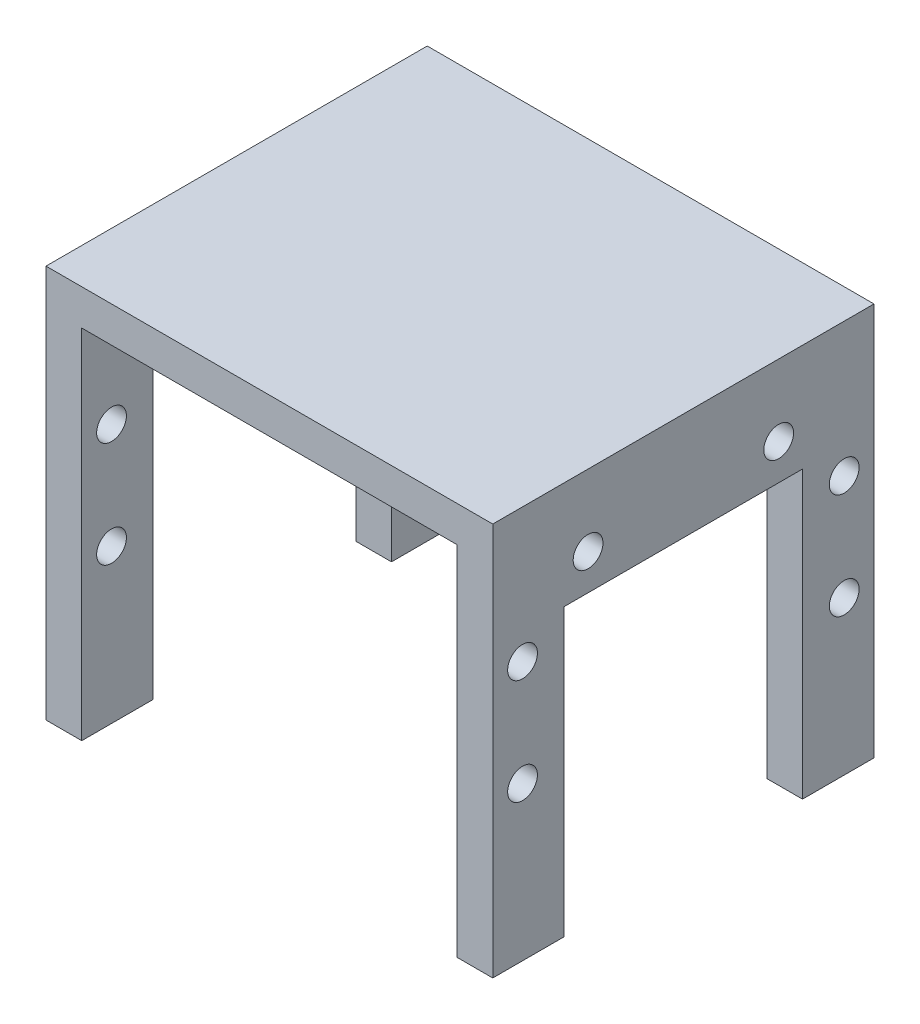
ISO-10303-21;
HEADER;
FILE_DESCRIPTION(('STEP AP214'),'2;1');
FILE_NAME('part.step','',(''),(''),'','','');
FILE_SCHEMA(('AUTOMOTIVE_DESIGN { 1 0 10303 214 1 1 1 1 }'));
ENDSEC;
DATA;
#1=APPLICATION_CONTEXT('core data for automotive mechanical design processes');
#2=APPLICATION_PROTOCOL_DEFINITION('international standard','automotive_design',2000,#1);
#3=PRODUCT_CONTEXT('',#1,'mechanical');
#4=PRODUCT('Part','Part','',(#3));
#5=PRODUCT_RELATED_PRODUCT_CATEGORY('part','',(#4));
#6=PRODUCT_DEFINITION_FORMATION('','',#4);
#7=PRODUCT_DEFINITION_CONTEXT('part definition',#1,'design');
#8=PRODUCT_DEFINITION('design','',#6,#7);
#9=PRODUCT_DEFINITION_SHAPE('','',#8);
#10=(LENGTH_UNIT() NAMED_UNIT(*) SI_UNIT(.MILLI.,.METRE.));
#11=(NAMED_UNIT(*) PLANE_ANGLE_UNIT() SI_UNIT($,.RADIAN.));
#12=(NAMED_UNIT(*) SI_UNIT($,.STERADIAN.) SOLID_ANGLE_UNIT());
#13=UNCERTAINTY_MEASURE_WITH_UNIT(LENGTH_MEASURE(1.E-05),#10,'distance_accuracy_value','');
#14=(GEOMETRIC_REPRESENTATION_CONTEXT(3) GLOBAL_UNCERTAINTY_ASSIGNED_CONTEXT((#13)) GLOBAL_UNIT_ASSIGNED_CONTEXT((#10,
#11,#12)) REPRESENTATION_CONTEXT('',''));
#15=CARTESIAN_POINT('',(0.,0.,0.));
#16=DIRECTION('',(0.,0.,1.));
#17=DIRECTION('',(1.,0.,0.));
#18=AXIS2_PLACEMENT_3D('',#15,#16,#17);
#19=CARTESIAN_POINT('',(-3.,0.,-32.));
#20=DIRECTION('',(0.,1.,0.));
#21=DIRECTION('',(0.,0.,-1.));
#22=AXIS2_PLACEMENT_3D('',#19,#20,#21);
#23=PLANE('',#22);
#24=DIRECTION('',(0.,0.,1.));
#25=VECTOR('',#24,1.);
#26=CARTESIAN_POINT('',(-3.,0.,-32.));
#27=LINE('',#26,#25);
#28=CARTESIAN_POINT('',(-3.,0.,-32.));
#29=VERTEX_POINT('',#28);
#30=CARTESIAN_POINT('',(-3.,0.,-26.));
#31=VERTEX_POINT('',#30);
#32=EDGE_CURVE('E240',#29,#31,#27,.T.);
#33=ORIENTED_EDGE('',*,*,#32,.F.);
#34=DIRECTION('',(1.,0.,0.));
#35=VECTOR('',#34,1.);
#36=CARTESIAN_POINT('',(-3.,0.,-32.));
#37=LINE('',#36,#35);
#38=CARTESIAN_POINT('',(0.,0.,-32.));
#39=VERTEX_POINT('',#38);
#40=EDGE_CURVE('E239',#29,#39,#37,.T.);
#41=ORIENTED_EDGE('',*,*,#40,.T.);
#42=DIRECTION('',(0.,0.,1.));
#43=VECTOR('',#42,1.);
#44=CARTESIAN_POINT('',(0.,0.,-32.));
#45=LINE('',#44,#43);
#46=CARTESIAN_POINT('',(0.,0.,-26.));
#47=VERTEX_POINT('',#46);
#48=EDGE_CURVE('E11',#39,#47,#45,.T.);
#49=ORIENTED_EDGE('',*,*,#48,.T.);
#50=DIRECTION('',(1.,0.,0.));
#51=VECTOR('',#50,1.);
#52=CARTESIAN_POINT('',(-34.2409987036266,0.,-26.));
#53=LINE('',#52,#51);
#54=EDGE_CURVE('E170',#31,#47,#53,.T.);
#55=ORIENTED_EDGE('',*,*,#54,.F.);
#56=EDGE_LOOP('',(#33,#41,#49,#55));
#57=FACE_BOUND('',#56,.T.);
#58=ADVANCED_FACE('F35',(#57),#23,.F.);
#59=CARTESIAN_POINT('',(31.5,0.,-32.));
#60=DIRECTION('',(0.,1.,0.));
#61=DIRECTION('',(-1.,0.,0.));
#62=AXIS2_PLACEMENT_3D('',#59,#60,#61);
#63=PLANE('',#62);
#64=DIRECTION('',(0.,0.,1.));
#65=VECTOR('',#64,1.);
#66=CARTESIAN_POINT('',(31.5,0.,-32.));
#67=LINE('',#66,#65);
#68=CARTESIAN_POINT('',(31.5,0.,-32.));
#69=VERTEX_POINT('',#68);
#70=CARTESIAN_POINT('',(31.5,0.,-26.));
#71=VERTEX_POINT('',#70);
#72=EDGE_CURVE('E179',#69,#71,#67,.T.);
#73=ORIENTED_EDGE('',*,*,#72,.F.);
#74=DIRECTION('',(1.,0.,0.));
#75=VECTOR('',#74,1.);
#76=CARTESIAN_POINT('',(31.5,0.,-32.));
#77=LINE('',#76,#75);
#78=CARTESIAN_POINT('',(34.5,0.,-32.));
#79=VERTEX_POINT('',#78);
#80=EDGE_CURVE('E174',#69,#79,#77,.T.);
#81=ORIENTED_EDGE('',*,*,#80,.T.);
#82=DIRECTION('',(0.,0.,1.));
#83=VECTOR('',#82,1.);
#84=CARTESIAN_POINT('',(34.5,0.,-32.));
#85=LINE('',#84,#83);
#86=CARTESIAN_POINT('',(34.5,0.,-26.));
#87=VERTEX_POINT('',#86);
#88=EDGE_CURVE('E155',#79,#87,#85,.T.);
#89=ORIENTED_EDGE('',*,*,#88,.T.);
#90=EDGE_CURVE('E163',#71,#87,#53,.T.);
#91=ORIENTED_EDGE('',*,*,#90,.F.);
#92=EDGE_LOOP('',(#73,#81,#89,#91));
#93=FACE_BOUND('',#92,.T.);
#94=ADVANCED_FACE('F172',(#93),#63,.F.);
#95=CARTESIAN_POINT('',(0.,0.,-6.));
#96=VERTEX_POINT('',#95);
#97=CARTESIAN_POINT('',(0.,0.,0.));
#98=VERTEX_POINT('',#97);
#99=EDGE_CURVE('E43',#96,#98,#45,.T.);
#100=ORIENTED_EDGE('',*,*,#99,.T.);
#101=DIRECTION('',(1.,0.,0.));
#102=VECTOR('',#101,1.);
#103=CARTESIAN_POINT('',(-3.,0.,0.));
#104=LINE('',#103,#102);
#105=CARTESIAN_POINT('',(-3.,0.,0.));
#106=VERTEX_POINT('',#105);
#107=EDGE_CURVE('E200',#106,#98,#104,.T.);
#108=ORIENTED_EDGE('',*,*,#107,.F.);
#109=CARTESIAN_POINT('',(-3.,0.,-6.));
#110=VERTEX_POINT('',#109);
#111=EDGE_CURVE('E243',#110,#106,#27,.T.);
#112=ORIENTED_EDGE('',*,*,#111,.F.);
#113=DIRECTION('',(1.,0.,0.));
#114=VECTOR('',#113,1.);
#115=CARTESIAN_POINT('',(-34.2409987036266,0.,-6.));
#116=LINE('',#115,#114);
#117=EDGE_CURVE('E202',#110,#96,#116,.T.);
#118=ORIENTED_EDGE('',*,*,#117,.T.);
#119=EDGE_LOOP('',(#100,#108,#112,#118));
#120=FACE_BOUND('',#119,.T.);
#121=ADVANCED_FACE('F37',(#120),#23,.F.);
#122=CARTESIAN_POINT('',(0.,0.,-32.));
#123=DIRECTION('',(-1.,0.,0.));
#124=DIRECTION('',(0.,0.,-1.));
#125=AXIS2_PLACEMENT_3D('',#122,#123,#124);
#126=PLANE('',#125);
#127=CARTESIAN_POINT('',(0.,12.89624,-29.5));
#128=DIRECTION('',(1.,0.,0.));
#129=DIRECTION('',(0.,0.,-1.));
#130=AXIS2_PLACEMENT_3D('',#127,#128,#129);
#131=CIRCLE('',#130,1.25);
#132=CARTESIAN_POINT('',(0.,12.89624,-30.75));
#133=VERTEX_POINT('',#132);
#134=EDGE_CURVE('E512',#133,#133,#131,.T.);
#135=ORIENTED_EDGE('',*,*,#134,.F.);
#136=EDGE_LOOP('',(#135));
#137=FACE_BOUND('',#136,.T.);
#138=CARTESIAN_POINT('',(0.,21.75,-29.5));
#139=DIRECTION('',(1.,0.,0.));
#140=DIRECTION('',(0.,0.,-1.));
#141=AXIS2_PLACEMENT_3D('',#138,#139,#140);
#142=CIRCLE('',#141,1.25);
#143=CARTESIAN_POINT('',(0.,21.75,-30.75));
#144=VERTEX_POINT('',#143);
#145=EDGE_CURVE('E530',#144,#144,#142,.T.);
#146=ORIENTED_EDGE('',*,*,#145,.F.);
#147=EDGE_LOOP('',(#146));
#148=FACE_BOUND('',#147,.T.);
#149=CARTESIAN_POINT('',(0.,12.89624,-2.5));
#150=DIRECTION('',(1.,0.,0.));
#151=DIRECTION('',(0.,0.,-1.));
#152=AXIS2_PLACEMENT_3D('',#149,#150,#151);
#153=CIRCLE('',#152,1.25);
#154=CARTESIAN_POINT('',(0.,12.89624,-3.75));
#155=VERTEX_POINT('',#154);
#156=EDGE_CURVE('E542',#155,#155,#153,.T.);
#157=ORIENTED_EDGE('',*,*,#156,.F.);
#158=EDGE_LOOP('',(#157));
#159=FACE_BOUND('',#158,.T.);
#160=CARTESIAN_POINT('',(0.,21.75,-2.5));
#161=DIRECTION('',(1.,0.,0.));
#162=DIRECTION('',(0.,0.,-1.));
#163=AXIS2_PLACEMENT_3D('',#160,#161,#162);
#164=CIRCLE('',#163,1.25);
#165=CARTESIAN_POINT('',(0.,21.75,-3.75));
#166=VERTEX_POINT('',#165);
#167=EDGE_CURVE('E554',#166,#166,#164,.T.);
#168=ORIENTED_EDGE('',*,*,#167,.F.);
#169=EDGE_LOOP('',(#168));
#170=FACE_BOUND('',#169,.T.);
#171=CARTESIAN_POINT('',(0.,27.,-8.));
#172=DIRECTION('',(1.,0.,0.));
#173=DIRECTION('',(0.,0.,-1.));
#174=AXIS2_PLACEMENT_3D('',#171,#172,#173);
#175=CIRCLE('',#174,1.25);
#176=CARTESIAN_POINT('',(0.,27.,-9.25));
#177=VERTEX_POINT('',#176);
#178=EDGE_CURVE('E566',#177,#177,#175,.T.);
#179=ORIENTED_EDGE('',*,*,#178,.F.);
#180=EDGE_LOOP('',(#179));
#181=FACE_BOUND('',#180,.T.);
#182=CARTESIAN_POINT('',(0.,27.,-24.));
#183=DIRECTION('',(1.,0.,0.));
#184=DIRECTION('',(0.,0.,-1.));
#185=AXIS2_PLACEMENT_3D('',#182,#183,#184);
#186=CIRCLE('',#185,1.25);
#187=CARTESIAN_POINT('',(0.,27.,-25.25));
#188=VERTEX_POINT('',#187);
#189=EDGE_CURVE('E160',#188,#188,#186,.T.);
#190=ORIENTED_EDGE('',*,*,#189,.F.);
#191=EDGE_LOOP('',(#190));
#192=FACE_BOUND('',#191,.T.);
#193=ORIENTED_EDGE('',*,*,#48,.F.);
#194=DIRECTION('',(0.,1.,0.));
#195=VECTOR('',#194,1.);
#196=CARTESIAN_POINT('',(0.,0.,-32.));
#197=LINE('',#196,#195);
#198=CARTESIAN_POINT('',(0.,30.,-32.));
#199=VERTEX_POINT('',#198);
#200=EDGE_CURVE('E283',#39,#199,#197,.T.);
#201=ORIENTED_EDGE('',*,*,#200,.T.);
#202=DIRECTION('',(0.,0.,1.));
#203=VECTOR('',#202,1.);
#204=CARTESIAN_POINT('',(0.,30.,-32.));
#205=LINE('',#204,#203);
#206=CARTESIAN_POINT('',(0.,30.,0.));
#207=VERTEX_POINT('',#206);
#208=EDGE_CURVE('E188',#199,#207,#205,.T.);
#209=ORIENTED_EDGE('',*,*,#208,.T.);
#210=DIRECTION('',(0.,1.,0.));
#211=VECTOR('',#210,1.);
#212=CARTESIAN_POINT('',(0.,0.,0.));
#213=LINE('',#212,#211);
#214=EDGE_CURVE('E209',#98,#207,#213,.T.);
#215=ORIENTED_EDGE('',*,*,#214,.F.);
#216=ORIENTED_EDGE('',*,*,#99,.F.);
#217=DIRECTION('',(0.,-1.,0.));
#218=VECTOR('',#217,1.);
#219=CARTESIAN_POINT('',(0.,0.,-6.));
#220=LINE('',#219,#218);
#221=CARTESIAN_POINT('',(0.,24.,-6.));
#222=VERTEX_POINT('',#221);
#223=EDGE_CURVE('E207',#222,#96,#220,.T.);
#224=ORIENTED_EDGE('',*,*,#223,.F.);
#225=DIRECTION('',(0.,0.,1.));
#226=VECTOR('',#225,1.);
#227=CARTESIAN_POINT('',(0.,24.,-32.));
#228=LINE('',#227,#226);
#229=CARTESIAN_POINT('',(0.,24.,-26.));
#230=VERTEX_POINT('',#229);
#231=EDGE_CURVE('E278',#230,#222,#228,.T.);
#232=ORIENTED_EDGE('',*,*,#231,.F.);
#233=DIRECTION('',(0.,1.,0.));
#234=VECTOR('',#233,1.);
#235=CARTESIAN_POINT('',(0.,0.,-26.));
#236=LINE('',#235,#234);
#237=EDGE_CURVE('E218',#47,#230,#236,.T.);
#238=ORIENTED_EDGE('',*,*,#237,.F.);
#239=EDGE_LOOP('',(#193,#201,#209,#215,#216,#224,#232,#238));
#240=FACE_BOUND('',#239,.T.);
#241=ADVANCED_FACE('F205',(#137,#148,#159,#170,#181,#192,#240),#126,.F.);
#242=CARTESIAN_POINT('',(0.,30.,-32.));
#243=DIRECTION('',(0.,1.,0.));
#244=DIRECTION('',(0.,0.,-1.));
#245=AXIS2_PLACEMENT_3D('',#242,#243,#244);
#246=PLANE('',#245);
#247=DIRECTION('',(1.,0.,0.));
#248=VECTOR('',#247,1.);
#249=CARTESIAN_POINT('',(0.,30.,0.));
#250=LINE('',#249,#248);
#251=CARTESIAN_POINT('',(31.5,30.,0.));
#252=VERTEX_POINT('',#251);
#253=EDGE_CURVE('E212',#207,#252,#250,.T.);
#254=ORIENTED_EDGE('',*,*,#253,.F.);
#255=ORIENTED_EDGE('',*,*,#208,.F.);
#256=DIRECTION('',(1.,0.,0.));
#257=VECTOR('',#256,1.);
#258=CARTESIAN_POINT('',(0.,30.,-32.));
#259=LINE('',#258,#257);
#260=CARTESIAN_POINT('',(31.5,30.,-32.));
#261=VERTEX_POINT('',#260);
#262=EDGE_CURVE('E285',#199,#261,#259,.T.);
#263=ORIENTED_EDGE('',*,*,#262,.T.);
#264=DIRECTION('',(0.,0.,1.));
#265=VECTOR('',#264,1.);
#266=CARTESIAN_POINT('',(31.5,30.,-32.));
#267=LINE('',#266,#265);
#268=EDGE_CURVE('E186',#261,#252,#267,.T.);
#269=ORIENTED_EDGE('',*,*,#268,.T.);
#270=EDGE_LOOP('',(#254,#255,#263,#269));
#271=FACE_BOUND('',#270,.T.);
#272=ADVANCED_FACE('F310',(#271),#246,.F.);
#273=CARTESIAN_POINT('',(31.5,30.,-32.));
#274=DIRECTION('',(1.,0.,0.));
#275=DIRECTION('',(0.,0.,1.));
#276=AXIS2_PLACEMENT_3D('',#273,#274,#275);
#277=PLANE('',#276);
#278=CARTESIAN_POINT('',(31.5,12.89624,-29.5));
#279=DIRECTION('',(-1.,0.,0.));
#280=DIRECTION('',(0.,0.,1.));
#281=AXIS2_PLACEMENT_3D('',#278,#279,#280);
#282=CIRCLE('',#281,1.25);
#283=CARTESIAN_POINT('',(31.5,12.89624,-28.25));
#284=VERTEX_POINT('',#283);
#285=EDGE_CURVE('E511',#284,#284,#282,.T.);
#286=ORIENTED_EDGE('',*,*,#285,.F.);
#287=EDGE_LOOP('',(#286));
#288=FACE_BOUND('',#287,.T.);
#289=CARTESIAN_POINT('',(31.5,21.75,-29.5));
#290=DIRECTION('',(-1.,0.,0.));
#291=DIRECTION('',(0.,0.,1.));
#292=AXIS2_PLACEMENT_3D('',#289,#290,#291);
#293=CIRCLE('',#292,1.25);
#294=CARTESIAN_POINT('',(31.5,21.75,-28.25));
#295=VERTEX_POINT('',#294);
#296=EDGE_CURVE('E527',#295,#295,#293,.T.);
#297=ORIENTED_EDGE('',*,*,#296,.F.);
#298=EDGE_LOOP('',(#297));
#299=FACE_BOUND('',#298,.T.);
#300=CARTESIAN_POINT('',(31.5,12.89624,-2.5));
#301=DIRECTION('',(-1.,0.,0.));
#302=DIRECTION('',(0.,0.,1.));
#303=AXIS2_PLACEMENT_3D('',#300,#301,#302);
#304=CIRCLE('',#303,1.25);
#305=CARTESIAN_POINT('',(31.5,12.89624,-1.25));
#306=VERTEX_POINT('',#305);
#307=EDGE_CURVE('E539',#306,#306,#304,.T.);
#308=ORIENTED_EDGE('',*,*,#307,.F.);
#309=EDGE_LOOP('',(#308));
#310=FACE_BOUND('',#309,.T.);
#311=CARTESIAN_POINT('',(31.5,21.75,-2.5));
#312=DIRECTION('',(-1.,0.,0.));
#313=DIRECTION('',(0.,0.,1.));
#314=AXIS2_PLACEMENT_3D('',#311,#312,#313);
#315=CIRCLE('',#314,1.25);
#316=CARTESIAN_POINT('',(31.5,21.75,-1.25));
#317=VERTEX_POINT('',#316);
#318=EDGE_CURVE('E551',#317,#317,#315,.T.);
#319=ORIENTED_EDGE('',*,*,#318,.F.);
#320=EDGE_LOOP('',(#319));
#321=FACE_BOUND('',#320,.T.);
#322=CARTESIAN_POINT('',(31.5,27.,-8.));
#323=DIRECTION('',(-1.,0.,0.));
#324=DIRECTION('',(0.,0.,1.));
#325=AXIS2_PLACEMENT_3D('',#322,#323,#324);
#326=CIRCLE('',#325,1.25);
#327=CARTESIAN_POINT('',(31.5,27.,-6.75));
#328=VERTEX_POINT('',#327);
#329=EDGE_CURVE('E563',#328,#328,#326,.T.);
#330=ORIENTED_EDGE('',*,*,#329,.F.);
#331=EDGE_LOOP('',(#330));
#332=FACE_BOUND('',#331,.T.);
#333=CARTESIAN_POINT('',(31.5,27.,-24.));
#334=DIRECTION('',(-1.,0.,0.));
#335=DIRECTION('',(0.,0.,1.));
#336=AXIS2_PLACEMENT_3D('',#333,#334,#335);
#337=CIRCLE('',#336,1.25);
#338=CARTESIAN_POINT('',(31.5,27.,-22.75));
#339=VERTEX_POINT('',#338);
#340=EDGE_CURVE('E575',#339,#339,#337,.T.);
#341=ORIENTED_EDGE('',*,*,#340,.F.);
#342=EDGE_LOOP('',(#341));
#343=FACE_BOUND('',#342,.T.);
#344=DIRECTION('',(0.,0.,-1.));
#345=VECTOR('',#344,1.);
#346=CARTESIAN_POINT('',(31.5,24.,-32.));
#347=LINE('',#346,#345);
#348=CARTESIAN_POINT('',(31.5,24.,-6.));
#349=VERTEX_POINT('',#348);
#350=CARTESIAN_POINT('',(31.5,24.,-26.));
#351=VERTEX_POINT('',#350);
#352=EDGE_CURVE('E275',#349,#351,#347,.T.);
#353=ORIENTED_EDGE('',*,*,#352,.F.);
#354=DIRECTION('',(0.,1.,0.));
#355=VECTOR('',#354,1.);
#356=CARTESIAN_POINT('',(31.5,30.,-6.));
#357=LINE('',#356,#355);
#358=CARTESIAN_POINT('',(31.5,0.,-6.));
#359=VERTEX_POINT('',#358);
#360=EDGE_CURVE('E270',#359,#349,#357,.T.);
#361=ORIENTED_EDGE('',*,*,#360,.F.);
#362=CARTESIAN_POINT('',(31.5,0.,0.));
#363=VERTEX_POINT('',#362);
#364=EDGE_CURVE('E175',#359,#363,#67,.T.);
#365=ORIENTED_EDGE('',*,*,#364,.T.);
#366=DIRECTION('',(0.,-1.,0.));
#367=VECTOR('',#366,1.);
#368=CARTESIAN_POINT('',(31.5,30.,0.));
#369=LINE('',#368,#367);
#370=EDGE_CURVE('E227',#252,#363,#369,.T.);
#371=ORIENTED_EDGE('',*,*,#370,.F.);
#372=ORIENTED_EDGE('',*,*,#268,.F.);
#373=DIRECTION('',(0.,-1.,0.));
#374=VECTOR('',#373,1.);
#375=CARTESIAN_POINT('',(31.5,30.,-32.));
#376=LINE('',#375,#374);
#377=EDGE_CURVE('E288',#261,#69,#376,.T.);
#378=ORIENTED_EDGE('',*,*,#377,.T.);
#379=ORIENTED_EDGE('',*,*,#72,.T.);
#380=DIRECTION('',(0.,-1.,0.));
#381=VECTOR('',#380,1.);
#382=CARTESIAN_POINT('',(31.5,30.,-26.));
#383=LINE('',#382,#381);
#384=EDGE_CURVE('E166',#351,#71,#383,.T.);
#385=ORIENTED_EDGE('',*,*,#384,.F.);
#386=EDGE_LOOP('',(#353,#361,#365,#371,#372,#378,#379,#385));
#387=FACE_BOUND('',#386,.T.);
#388=ADVANCED_FACE('F313',(#288,#299,#310,#321,#332,#343,#387),#277,.F.);
#389=CARTESIAN_POINT('',(34.5,0.,-6.00000000000001));
#390=VERTEX_POINT('',#389);
#391=CARTESIAN_POINT('',(34.5,0.,0.));
#392=VERTEX_POINT('',#391);
#393=EDGE_CURVE('E176',#390,#392,#85,.T.);
#394=ORIENTED_EDGE('',*,*,#393,.T.);
#395=DIRECTION('',(1.,0.,0.));
#396=VECTOR('',#395,1.);
#397=CARTESIAN_POINT('',(31.5,0.,0.));
#398=LINE('',#397,#396);
#399=EDGE_CURVE('E230',#363,#392,#398,.T.);
#400=ORIENTED_EDGE('',*,*,#399,.F.);
#401=ORIENTED_EDGE('',*,*,#364,.F.);
#402=EDGE_CURVE('E257',#359,#390,#116,.T.);
#403=ORIENTED_EDGE('',*,*,#402,.T.);
#404=EDGE_LOOP('',(#394,#400,#401,#403));
#405=FACE_BOUND('',#404,.T.);
#406=ADVANCED_FACE('F256',(#405),#63,.F.);
#407=CARTESIAN_POINT('',(34.5,33.,-32.));
#408=DIRECTION('',(-1.,0.,0.));
#409=DIRECTION('',(0.,0.,-1.));
#410=AXIS2_PLACEMENT_3D('',#407,#408,#409);
#411=PLANE('',#410);
#412=CARTESIAN_POINT('',(34.5,12.89624,-29.5));
#413=DIRECTION('',(-1.,0.,0.));
#414=DIRECTION('',(0.,0.,1.));
#415=AXIS2_PLACEMENT_3D('',#412,#413,#414);
#416=CIRCLE('',#415,1.25);
#417=CARTESIAN_POINT('',(34.5,12.89624,-28.25));
#418=VERTEX_POINT('',#417);
#419=EDGE_CURVE('E508',#418,#418,#416,.T.);
#420=ORIENTED_EDGE('',*,*,#419,.T.);
#421=EDGE_LOOP('',(#420));
#422=FACE_BOUND('',#421,.T.);
#423=CARTESIAN_POINT('',(34.5,21.75,-29.5));
#424=DIRECTION('',(-1.,0.,0.));
#425=DIRECTION('',(0.,0.,1.));
#426=AXIS2_PLACEMENT_3D('',#423,#424,#425);
#427=CIRCLE('',#426,1.25);
#428=CARTESIAN_POINT('',(34.5,21.75,-28.25));
#429=VERTEX_POINT('',#428);
#430=EDGE_CURVE('E516',#429,#429,#427,.T.);
#431=ORIENTED_EDGE('',*,*,#430,.T.);
#432=EDGE_LOOP('',(#431));
#433=FACE_BOUND('',#432,.T.);
#434=CARTESIAN_POINT('',(34.5,12.89624,-2.5));
#435=DIRECTION('',(-1.,0.,0.));
#436=DIRECTION('',(0.,0.,1.));
#437=AXIS2_PLACEMENT_3D('',#434,#435,#436);
#438=CIRCLE('',#437,1.25);
#439=CARTESIAN_POINT('',(34.5,12.89624,-1.25));
#440=VERTEX_POINT('',#439);
#441=EDGE_CURVE('E533',#440,#440,#438,.T.);
#442=ORIENTED_EDGE('',*,*,#441,.T.);
#443=EDGE_LOOP('',(#442));
#444=FACE_BOUND('',#443,.T.);
#445=CARTESIAN_POINT('',(34.5,21.75,-2.5));
#446=DIRECTION('',(-1.,0.,0.));
#447=DIRECTION('',(0.,0.,1.));
#448=AXIS2_PLACEMENT_3D('',#445,#446,#447);
#449=CIRCLE('',#448,1.25);
#450=CARTESIAN_POINT('',(34.5,21.75,-1.25));
#451=VERTEX_POINT('',#450);
#452=EDGE_CURVE('E545',#451,#451,#449,.T.);
#453=ORIENTED_EDGE('',*,*,#452,.T.);
#454=EDGE_LOOP('',(#453));
#455=FACE_BOUND('',#454,.T.);
#456=CARTESIAN_POINT('',(34.5,27.,-8.));
#457=DIRECTION('',(-1.,0.,0.));
#458=DIRECTION('',(0.,0.,1.));
#459=AXIS2_PLACEMENT_3D('',#456,#457,#458);
#460=CIRCLE('',#459,1.25);
#461=CARTESIAN_POINT('',(34.5,27.,-6.75));
#462=VERTEX_POINT('',#461);
#463=EDGE_CURVE('E557',#462,#462,#460,.T.);
#464=ORIENTED_EDGE('',*,*,#463,.T.);
#465=EDGE_LOOP('',(#464));
#466=FACE_BOUND('',#465,.T.);
#467=CARTESIAN_POINT('',(34.5,27.,-24.));
#468=DIRECTION('',(-1.,0.,0.));
#469=DIRECTION('',(0.,0.,1.));
#470=AXIS2_PLACEMENT_3D('',#467,#468,#469);
#471=CIRCLE('',#470,1.25);
#472=CARTESIAN_POINT('',(34.5,27.,-22.75));
#473=VERTEX_POINT('',#472);
#474=EDGE_CURVE('E569',#473,#473,#471,.T.);
#475=ORIENTED_EDGE('',*,*,#474,.T.);
#476=EDGE_LOOP('',(#475));
#477=FACE_BOUND('',#476,.T.);
#478=ORIENTED_EDGE('',*,*,#88,.F.);
#479=DIRECTION('',(0.,1.,0.));
#480=VECTOR('',#479,1.);
#481=CARTESIAN_POINT('',(34.5,33.,-32.));
#482=LINE('',#481,#480);
#483=CARTESIAN_POINT('',(34.5,33.,-32.));
#484=VERTEX_POINT('',#483);
#485=EDGE_CURVE('E251',#79,#484,#482,.T.);
#486=ORIENTED_EDGE('',*,*,#485,.T.);
#487=DIRECTION('',(0.,0.,1.));
#488=VECTOR('',#487,1.);
#489=CARTESIAN_POINT('',(34.5,33.,-32.));
#490=LINE('',#489,#488);
#491=CARTESIAN_POINT('',(34.5,33.,0.));
#492=VERTEX_POINT('',#491);
#493=EDGE_CURVE('E182',#484,#492,#490,.T.);
#494=ORIENTED_EDGE('',*,*,#493,.T.);
#495=DIRECTION('',(0.,1.,0.));
#496=VECTOR('',#495,1.);
#497=CARTESIAN_POINT('',(34.5,33.,0.));
#498=LINE('',#497,#496);
#499=EDGE_CURVE('E233',#392,#492,#498,.T.);
#500=ORIENTED_EDGE('',*,*,#499,.F.);
#501=ORIENTED_EDGE('',*,*,#393,.F.);
#502=DIRECTION('',(0.,1.,0.));
#503=VECTOR('',#502,1.);
#504=CARTESIAN_POINT('',(34.5,0.,-6.));
#505=LINE('',#504,#503);
#506=CARTESIAN_POINT('',(34.5,24.,-6.));
#507=VERTEX_POINT('',#506);
#508=EDGE_CURVE('E50',#390,#507,#505,.T.);
#509=ORIENTED_EDGE('',*,*,#508,.T.);
#510=DIRECTION('',(0.,0.,-1.));
#511=VECTOR('',#510,1.);
#512=CARTESIAN_POINT('',(34.5,24.,-26.));
#513=LINE('',#512,#511);
#514=CARTESIAN_POINT('',(34.5,24.,-26.));
#515=VERTEX_POINT('',#514);
#516=EDGE_CURVE('E158',#507,#515,#513,.T.);
#517=ORIENTED_EDGE('',*,*,#516,.T.);
#518=DIRECTION('',(0.,-1.,0.));
#519=VECTOR('',#518,1.);
#520=CARTESIAN_POINT('',(34.5,0.,-26.));
#521=LINE('',#520,#519);
#522=EDGE_CURVE('E150',#515,#87,#521,.T.);
#523=ORIENTED_EDGE('',*,*,#522,.T.);
#524=EDGE_LOOP('',(#478,#486,#494,#500,#501,#509,#517,#523));
#525=FACE_BOUND('',#524,.T.);
#526=ADVANCED_FACE('F152',(#422,#433,#444,#455,#466,#477,#525),#411,.F.);
#527=CARTESIAN_POINT('',(-3.,33.,-32.));
#528=DIRECTION('',(0.,-1.,0.));
#529=DIRECTION('',(0.,0.,1.));
#530=AXIS2_PLACEMENT_3D('',#527,#528,#529);
#531=PLANE('',#530);
#532=DIRECTION('',(-1.,0.,0.));
#533=VECTOR('',#532,1.);
#534=CARTESIAN_POINT('',(-3.,33.,0.));
#535=LINE('',#534,#533);
#536=CARTESIAN_POINT('',(-3.,33.,0.));
#537=VERTEX_POINT('',#536);
#538=EDGE_CURVE('E236',#492,#537,#535,.T.);
#539=ORIENTED_EDGE('',*,*,#538,.F.);
#540=ORIENTED_EDGE('',*,*,#493,.F.);
#541=DIRECTION('',(-1.,0.,0.));
#542=VECTOR('',#541,1.);
#543=CARTESIAN_POINT('',(-3.,33.,-32.));
#544=LINE('',#543,#542);
#545=CARTESIAN_POINT('',(-3.,33.,-32.));
#546=VERTEX_POINT('',#545);
#547=EDGE_CURVE('E253',#484,#546,#544,.T.);
#548=ORIENTED_EDGE('',*,*,#547,.T.);
#549=DIRECTION('',(0.,0.,1.));
#550=VECTOR('',#549,1.);
#551=CARTESIAN_POINT('',(-3.,33.,-32.));
#552=LINE('',#551,#550);
#553=EDGE_CURVE('E242',#546,#537,#552,.T.);
#554=ORIENTED_EDGE('',*,*,#553,.T.);
#555=EDGE_LOOP('',(#539,#540,#548,#554));
#556=FACE_BOUND('',#555,.T.);
#557=ADVANCED_FACE('F252',(#556),#531,.F.);
#558=CARTESIAN_POINT('',(-3.,0.,-32.));
#559=DIRECTION('',(1.,0.,0.));
#560=DIRECTION('',(0.,0.,1.));
#561=AXIS2_PLACEMENT_3D('',#558,#559,#560);
#562=PLANE('',#561);
#563=CARTESIAN_POINT('',(-3.,12.89624,-29.5));
#564=DIRECTION('',(-1.,0.,0.));
#565=DIRECTION('',(0.,0.,1.));
#566=AXIS2_PLACEMENT_3D('',#563,#564,#565);
#567=CIRCLE('',#566,1.25);
#568=CARTESIAN_POINT('',(-3.,12.89624,-28.25));
#569=VERTEX_POINT('',#568);
#570=EDGE_CURVE('E513',#569,#569,#567,.F.);
#571=ORIENTED_EDGE('',*,*,#570,.T.);
#572=EDGE_LOOP('',(#571));
#573=FACE_BOUND('',#572,.T.);
#574=CARTESIAN_POINT('',(-3.,21.75,-29.5));
#575=DIRECTION('',(-1.,0.,0.));
#576=DIRECTION('',(0.,0.,1.));
#577=AXIS2_PLACEMENT_3D('',#574,#575,#576);
#578=CIRCLE('',#577,1.25);
#579=CARTESIAN_POINT('',(-3.,21.75,-28.25));
#580=VERTEX_POINT('',#579);
#581=EDGE_CURVE('E524',#580,#580,#578,.F.);
#582=ORIENTED_EDGE('',*,*,#581,.T.);
#583=EDGE_LOOP('',(#582));
#584=FACE_BOUND('',#583,.T.);
#585=CARTESIAN_POINT('',(-3.,12.89624,-2.5));
#586=DIRECTION('',(-1.,0.,0.));
#587=DIRECTION('',(0.,0.,1.));
#588=AXIS2_PLACEMENT_3D('',#585,#586,#587);
#589=CIRCLE('',#588,1.25);
#590=CARTESIAN_POINT('',(-3.,12.89624,-1.25));
#591=VERTEX_POINT('',#590);
#592=EDGE_CURVE('E536',#591,#591,#589,.F.);
#593=ORIENTED_EDGE('',*,*,#592,.T.);
#594=EDGE_LOOP('',(#593));
#595=FACE_BOUND('',#594,.T.);
#596=CARTESIAN_POINT('',(-3.,21.75,-2.5));
#597=DIRECTION('',(-1.,0.,0.));
#598=DIRECTION('',(0.,0.,1.));
#599=AXIS2_PLACEMENT_3D('',#596,#597,#598);
#600=CIRCLE('',#599,1.25);
#601=CARTESIAN_POINT('',(-3.,21.75,-1.25));
#602=VERTEX_POINT('',#601);
#603=EDGE_CURVE('E548',#602,#602,#600,.F.);
#604=ORIENTED_EDGE('',*,*,#603,.T.);
#605=EDGE_LOOP('',(#604));
#606=FACE_BOUND('',#605,.T.);
#607=CARTESIAN_POINT('',(-3.,27.,-8.));
#608=DIRECTION('',(-1.,0.,0.));
#609=DIRECTION('',(0.,0.,1.));
#610=AXIS2_PLACEMENT_3D('',#607,#608,#609);
#611=CIRCLE('',#610,1.25);
#612=CARTESIAN_POINT('',(-3.,27.,-6.75));
#613=VERTEX_POINT('',#612);
#614=EDGE_CURVE('E560',#613,#613,#611,.F.);
#615=ORIENTED_EDGE('',*,*,#614,.T.);
#616=EDGE_LOOP('',(#615));
#617=FACE_BOUND('',#616,.T.);
#618=CARTESIAN_POINT('',(-3.,27.,-24.));
#619=DIRECTION('',(-1.,0.,0.));
#620=DIRECTION('',(0.,0.,1.));
#621=AXIS2_PLACEMENT_3D('',#618,#619,#620);
#622=CIRCLE('',#621,1.25);
#623=CARTESIAN_POINT('',(-3.,27.,-22.75));
#624=VERTEX_POINT('',#623);
#625=EDGE_CURVE('E572',#624,#624,#622,.F.);
#626=ORIENTED_EDGE('',*,*,#625,.T.);
#627=EDGE_LOOP('',(#626));
#628=FACE_BOUND('',#627,.T.);
#629=DIRECTION('',(0.,0.,1.));
#630=VECTOR('',#629,1.);
#631=CARTESIAN_POINT('',(-3.,24.,-26.));
#632=LINE('',#631,#630);
#633=CARTESIAN_POINT('',(-3.,24.,-26.));
#634=VERTEX_POINT('',#633);
#635=CARTESIAN_POINT('',(-3.,24.,-6.));
#636=VERTEX_POINT('',#635);
#637=EDGE_CURVE('E296',#634,#636,#632,.T.);
#638=ORIENTED_EDGE('',*,*,#637,.T.);
#639=DIRECTION('',(0.,-1.,0.));
#640=VECTOR('',#639,1.);
#641=CARTESIAN_POINT('',(-3.,0.,-6.));
#642=LINE('',#641,#640);
#643=EDGE_CURVE('E264',#636,#110,#642,.T.);
#644=ORIENTED_EDGE('',*,*,#643,.T.);
#645=ORIENTED_EDGE('',*,*,#111,.T.);
#646=DIRECTION('',(0.,-1.,0.));
#647=VECTOR('',#646,1.);
#648=CARTESIAN_POINT('',(-3.,0.,0.));
#649=LINE('',#648,#647);
#650=EDGE_CURVE('E216',#537,#106,#649,.T.);
#651=ORIENTED_EDGE('',*,*,#650,.F.);
#652=ORIENTED_EDGE('',*,*,#553,.F.);
#653=DIRECTION('',(0.,-1.,0.));
#654=VECTOR('',#653,1.);
#655=CARTESIAN_POINT('',(-3.,0.,-32.));
#656=LINE('',#655,#654);
#657=EDGE_CURVE('E223',#546,#29,#656,.T.);
#658=ORIENTED_EDGE('',*,*,#657,.T.);
#659=ORIENTED_EDGE('',*,*,#32,.T.);
#660=DIRECTION('',(0.,1.,0.));
#661=VECTOR('',#660,1.);
#662=CARTESIAN_POINT('',(-3.,0.,-26.));
#663=LINE('',#662,#661);
#664=EDGE_CURVE('E273',#31,#634,#663,.T.);
#665=ORIENTED_EDGE('',*,*,#664,.T.);
#666=EDGE_LOOP('',(#638,#644,#645,#651,#652,#658,#659,#665));
#667=FACE_BOUND('',#666,.T.);
#668=ADVANCED_FACE('F294',(#573,#584,#595,#606,#617,#628,#667),#562,.F.);
#669=CARTESIAN_POINT('',(0.,0.,-32.));
#670=DIRECTION('',(0.,0.,-1.));
#671=DIRECTION('',(1.,0.,0.));
#672=AXIS2_PLACEMENT_3D('',#669,#670,#671);
#673=PLANE('',#672);
#674=ORIENTED_EDGE('',*,*,#40,.F.);
#675=ORIENTED_EDGE('',*,*,#657,.F.);
#676=ORIENTED_EDGE('',*,*,#547,.F.);
#677=ORIENTED_EDGE('',*,*,#485,.F.);
#678=ORIENTED_EDGE('',*,*,#80,.F.);
#679=ORIENTED_EDGE('',*,*,#377,.F.);
#680=ORIENTED_EDGE('',*,*,#262,.F.);
#681=ORIENTED_EDGE('',*,*,#200,.F.);
#682=EDGE_LOOP('',(#674,#675,#676,#677,#678,#679,#680,#681));
#683=FACE_BOUND('',#682,.T.);
#684=ADVANCED_FACE('F307',(#683),#673,.T.);
#685=CARTESIAN_POINT('',(0.,0.,0.));
#686=DIRECTION('',(0.,0.,-1.));
#687=DIRECTION('',(1.,0.,0.));
#688=AXIS2_PLACEMENT_3D('',#685,#686,#687);
#689=PLANE('',#688);
#690=ORIENTED_EDGE('',*,*,#107,.T.);
#691=ORIENTED_EDGE('',*,*,#214,.T.);
#692=ORIENTED_EDGE('',*,*,#253,.T.);
#693=ORIENTED_EDGE('',*,*,#370,.T.);
#694=ORIENTED_EDGE('',*,*,#399,.T.);
#695=ORIENTED_EDGE('',*,*,#499,.T.);
#696=ORIENTED_EDGE('',*,*,#538,.T.);
#697=ORIENTED_EDGE('',*,*,#650,.T.);
#698=EDGE_LOOP('',(#690,#691,#692,#693,#694,#695,#696,#697));
#699=FACE_BOUND('',#698,.T.);
#700=ADVANCED_FACE('F214',(#699),#689,.F.);
#701=CARTESIAN_POINT('',(-34.2409987036266,0.,-6.));
#702=DIRECTION('',(0.,0.,1.));
#703=DIRECTION('',(-1.,0.,0.));
#704=AXIS2_PLACEMENT_3D('',#701,#702,#703);
#705=PLANE('',#704);
#706=DIRECTION('',(1.,0.,0.));
#707=VECTOR('',#706,1.);
#708=CARTESIAN_POINT('',(-34.2409987036266,24.,-6.));
#709=LINE('',#708,#707);
#710=EDGE_CURVE('E58',#636,#222,#709,.T.);
#711=ORIENTED_EDGE('',*,*,#710,.T.);
#712=ORIENTED_EDGE('',*,*,#223,.T.);
#713=ORIENTED_EDGE('',*,*,#117,.F.);
#714=ORIENTED_EDGE('',*,*,#643,.F.);
#715=EDGE_LOOP('',(#711,#712,#713,#714));
#716=FACE_BOUND('',#715,.T.);
#717=ADVANCED_FACE('F299',(#716),#705,.F.);
#718=CARTESIAN_POINT('',(-34.2409987036266,24.,-26.));
#719=DIRECTION('',(0.,1.,0.));
#720=DIRECTION('',(0.,0.,-1.));
#721=AXIS2_PLACEMENT_3D('',#718,#719,#720);
#722=PLANE('',#721);
#723=DIRECTION('',(1.,0.,0.));
#724=VECTOR('',#723,1.);
#725=CARTESIAN_POINT('',(-34.2409987036266,24.,-26.));
#726=LINE('',#725,#724);
#727=EDGE_CURVE('E262',#634,#230,#726,.T.);
#728=ORIENTED_EDGE('',*,*,#727,.T.);
#729=ORIENTED_EDGE('',*,*,#231,.T.);
#730=ORIENTED_EDGE('',*,*,#710,.F.);
#731=ORIENTED_EDGE('',*,*,#637,.F.);
#732=EDGE_LOOP('',(#728,#729,#730,#731));
#733=FACE_BOUND('',#732,.T.);
#734=ADVANCED_FACE('F300',(#733),#722,.F.);
#735=CARTESIAN_POINT('',(-34.2409987036266,0.,-26.));
#736=DIRECTION('',(0.,0.,-1.));
#737=DIRECTION('',(1.,0.,0.));
#738=AXIS2_PLACEMENT_3D('',#735,#736,#737);
#739=PLANE('',#738);
#740=ORIENTED_EDGE('',*,*,#54,.T.);
#741=ORIENTED_EDGE('',*,*,#237,.T.);
#742=ORIENTED_EDGE('',*,*,#727,.F.);
#743=ORIENTED_EDGE('',*,*,#664,.F.);
#744=EDGE_LOOP('',(#740,#741,#742,#743));
#745=FACE_BOUND('',#744,.T.);
#746=ADVANCED_FACE('F303',(#745),#739,.F.);
#747=EDGE_CURVE('E265',#351,#515,#726,.T.);
#748=ORIENTED_EDGE('',*,*,#747,.F.);
#749=ORIENTED_EDGE('',*,*,#384,.T.);
#750=ORIENTED_EDGE('',*,*,#90,.T.);
#751=ORIENTED_EDGE('',*,*,#522,.F.);
#752=EDGE_LOOP('',(#748,#749,#750,#751));
#753=FACE_BOUND('',#752,.T.);
#754=ADVANCED_FACE('F164',(#753),#739,.F.);
#755=EDGE_CURVE('E267',#349,#507,#709,.T.);
#756=ORIENTED_EDGE('',*,*,#755,.F.);
#757=ORIENTED_EDGE('',*,*,#352,.T.);
#758=ORIENTED_EDGE('',*,*,#747,.T.);
#759=ORIENTED_EDGE('',*,*,#516,.F.);
#760=EDGE_LOOP('',(#756,#757,#758,#759));
#761=FACE_BOUND('',#760,.T.);
#762=ADVANCED_FACE('F317',(#761),#722,.F.);
#763=ORIENTED_EDGE('',*,*,#402,.F.);
#764=ORIENTED_EDGE('',*,*,#360,.T.);
#765=ORIENTED_EDGE('',*,*,#755,.T.);
#766=ORIENTED_EDGE('',*,*,#508,.F.);
#767=EDGE_LOOP('',(#763,#764,#765,#766));
#768=FACE_BOUND('',#767,.T.);
#769=ADVANCED_FACE('F315',(#768),#705,.F.);
#770=CARTESIAN_POINT('',(-6.53553390593274,27.,-24.));
#771=DIRECTION('',(1.,0.,0.));
#772=DIRECTION('',(0.,0.,1.));
#773=AXIS2_PLACEMENT_3D('',#770,#771,#772);
#774=CYLINDRICAL_SURFACE('',#773,1.25);
#775=ORIENTED_EDGE('',*,*,#625,.F.);
#776=EDGE_LOOP('',(#775));
#777=FACE_BOUND('',#776,.T.);
#778=ORIENTED_EDGE('',*,*,#189,.T.);
#779=EDGE_LOOP('',(#778));
#780=FACE_BOUND('',#779,.T.);
#781=ADVANCED_FACE('F324',(#777,#780),#774,.F.);
#782=ORIENTED_EDGE('',*,*,#474,.F.);
#783=EDGE_LOOP('',(#782));
#784=FACE_BOUND('',#783,.T.);
#785=ORIENTED_EDGE('',*,*,#340,.T.);
#786=EDGE_LOOP('',(#785));
#787=FACE_BOUND('',#786,.T.);
#788=ADVANCED_FACE('F398',(#784,#787),#774,.F.);
#789=CARTESIAN_POINT('',(-6.53553390593274,27.,-8.));
#790=DIRECTION('',(1.,0.,0.));
#791=DIRECTION('',(0.,0.,1.));
#792=AXIS2_PLACEMENT_3D('',#789,#790,#791);
#793=CYLINDRICAL_SURFACE('',#792,1.25);
#794=ORIENTED_EDGE('',*,*,#614,.F.);
#795=EDGE_LOOP('',(#794));
#796=FACE_BOUND('',#795,.T.);
#797=ORIENTED_EDGE('',*,*,#178,.T.);
#798=EDGE_LOOP('',(#797));
#799=FACE_BOUND('',#798,.T.);
#800=ADVANCED_FACE('F407',(#796,#799),#793,.F.);
#801=ORIENTED_EDGE('',*,*,#463,.F.);
#802=EDGE_LOOP('',(#801));
#803=FACE_BOUND('',#802,.T.);
#804=ORIENTED_EDGE('',*,*,#329,.T.);
#805=EDGE_LOOP('',(#804));
#806=FACE_BOUND('',#805,.T.);
#807=ADVANCED_FACE('F416',(#803,#806),#793,.F.);
#808=CARTESIAN_POINT('',(-6.53553390593274,21.75,-2.5));
#809=DIRECTION('',(1.,0.,0.));
#810=DIRECTION('',(0.,0.,1.));
#811=AXIS2_PLACEMENT_3D('',#808,#809,#810);
#812=CYLINDRICAL_SURFACE('',#811,1.25);
#813=ORIENTED_EDGE('',*,*,#603,.F.);
#814=EDGE_LOOP('',(#813));
#815=FACE_BOUND('',#814,.T.);
#816=ORIENTED_EDGE('',*,*,#167,.T.);
#817=EDGE_LOOP('',(#816));
#818=FACE_BOUND('',#817,.T.);
#819=ADVANCED_FACE('F426',(#815,#818),#812,.F.);
#820=ORIENTED_EDGE('',*,*,#452,.F.);
#821=EDGE_LOOP('',(#820));
#822=FACE_BOUND('',#821,.T.);
#823=ORIENTED_EDGE('',*,*,#318,.T.);
#824=EDGE_LOOP('',(#823));
#825=FACE_BOUND('',#824,.T.);
#826=ADVANCED_FACE('F435',(#822,#825),#812,.F.);
#827=CARTESIAN_POINT('',(-6.53553390593274,12.89624,-2.5));
#828=DIRECTION('',(1.,0.,0.));
#829=DIRECTION('',(0.,0.,1.));
#830=AXIS2_PLACEMENT_3D('',#827,#828,#829);
#831=CYLINDRICAL_SURFACE('',#830,1.25);
#832=ORIENTED_EDGE('',*,*,#592,.F.);
#833=EDGE_LOOP('',(#832));
#834=FACE_BOUND('',#833,.T.);
#835=ORIENTED_EDGE('',*,*,#156,.T.);
#836=EDGE_LOOP('',(#835));
#837=FACE_BOUND('',#836,.T.);
#838=ADVANCED_FACE('F445',(#834,#837),#831,.F.);
#839=ORIENTED_EDGE('',*,*,#441,.F.);
#840=EDGE_LOOP('',(#839));
#841=FACE_BOUND('',#840,.T.);
#842=ORIENTED_EDGE('',*,*,#307,.T.);
#843=EDGE_LOOP('',(#842));
#844=FACE_BOUND('',#843,.T.);
#845=ADVANCED_FACE('F454',(#841,#844),#831,.F.);
#846=CARTESIAN_POINT('',(-6.53553390593274,21.75,-29.5));
#847=DIRECTION('',(1.,0.,0.));
#848=DIRECTION('',(0.,0.,1.));
#849=AXIS2_PLACEMENT_3D('',#846,#847,#848);
#850=CYLINDRICAL_SURFACE('',#849,1.25);
#851=ORIENTED_EDGE('',*,*,#581,.F.);
#852=EDGE_LOOP('',(#851));
#853=FACE_BOUND('',#852,.T.);
#854=ORIENTED_EDGE('',*,*,#145,.T.);
#855=EDGE_LOOP('',(#854));
#856=FACE_BOUND('',#855,.T.);
#857=ADVANCED_FACE('F464',(#853,#856),#850,.F.);
#858=ORIENTED_EDGE('',*,*,#430,.F.);
#859=EDGE_LOOP('',(#858));
#860=FACE_BOUND('',#859,.T.);
#861=ORIENTED_EDGE('',*,*,#296,.T.);
#862=EDGE_LOOP('',(#861));
#863=FACE_BOUND('',#862,.T.);
#864=ADVANCED_FACE('F473',(#860,#863),#850,.F.);
#865=CARTESIAN_POINT('',(-6.53553390593274,12.89624,-29.5));
#866=DIRECTION('',(1.,0.,0.));
#867=DIRECTION('',(0.,0.,1.));
#868=AXIS2_PLACEMENT_3D('',#865,#866,#867);
#869=CYLINDRICAL_SURFACE('',#868,1.25);
#870=ORIENTED_EDGE('',*,*,#570,.F.);
#871=EDGE_LOOP('',(#870));
#872=FACE_BOUND('',#871,.T.);
#873=ORIENTED_EDGE('',*,*,#134,.T.);
#874=EDGE_LOOP('',(#873));
#875=FACE_BOUND('',#874,.T.);
#876=ADVANCED_FACE('F483',(#872,#875),#869,.F.);
#877=ORIENTED_EDGE('',*,*,#419,.F.);
#878=EDGE_LOOP('',(#877));
#879=FACE_BOUND('',#878,.T.);
#880=ORIENTED_EDGE('',*,*,#285,.T.);
#881=EDGE_LOOP('',(#880));
#882=FACE_BOUND('',#881,.T.);
#883=ADVANCED_FACE('F492',(#879,#882),#869,.F.);
#884=CLOSED_SHELL('',(#58,#94,#121,#241,#272,#388,#406,#526,#557,#668,#684,#700,#717,#734,#746,
#754,#762,#769,#781,#788,#800,#807,#819,#826,#838,#845,#857,#864,#876,#883));
#885=MANIFOLD_SOLID_BREP('B2',#884);
#886=ADVANCED_BREP_SHAPE_REPRESENTATION('',(#18,#885),#14);
#887=SHAPE_DEFINITION_REPRESENTATION(#9,#886);
ENDSEC;
END-ISO-10303-21;
